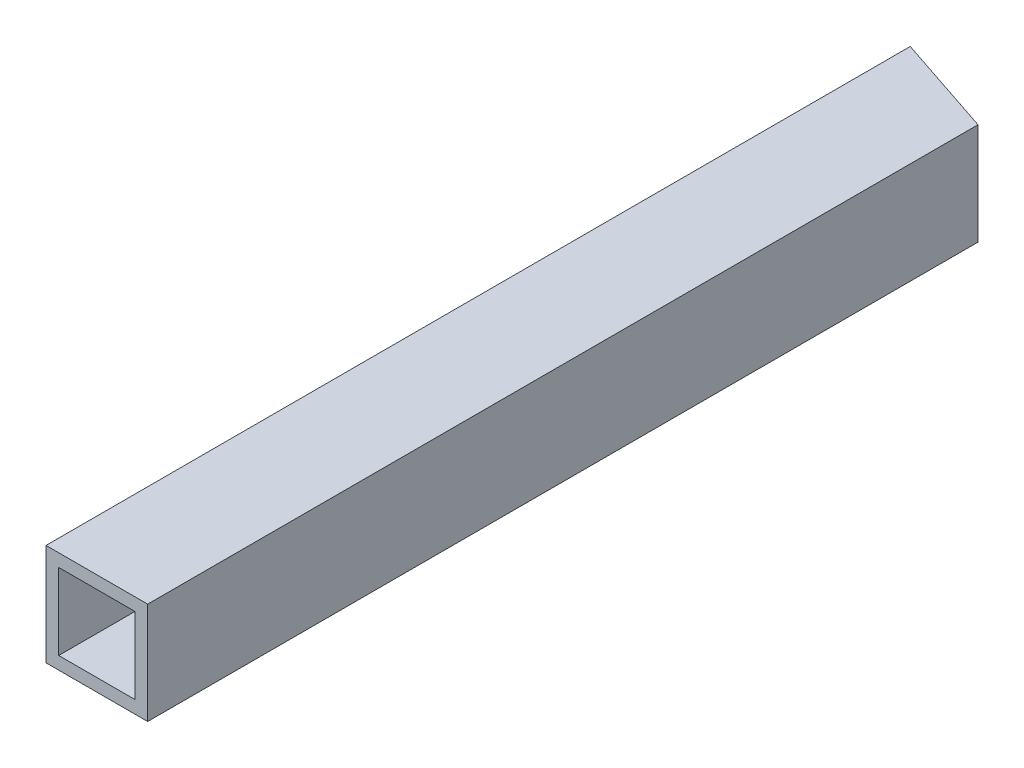
ISO-10303-21;
HEADER;
FILE_DESCRIPTION(('STEP AP214'),'2;1');
FILE_NAME('part.step','',(''),(''),'','','');
FILE_SCHEMA(('AUTOMOTIVE_DESIGN { 1 0 10303 214 1 1 1 1 }'));
ENDSEC;
DATA;
#1=APPLICATION_CONTEXT('core data for automotive mechanical design processes');
#2=APPLICATION_PROTOCOL_DEFINITION('international standard','automotive_design',2000,#1);
#3=PRODUCT_CONTEXT('',#1,'mechanical');
#4=PRODUCT('Part','Part','',(#3));
#5=PRODUCT_RELATED_PRODUCT_CATEGORY('part','',(#4));
#6=PRODUCT_DEFINITION_FORMATION('','',#4);
#7=PRODUCT_DEFINITION_CONTEXT('part definition',#1,'design');
#8=PRODUCT_DEFINITION('design','',#6,#7);
#9=PRODUCT_DEFINITION_SHAPE('','',#8);
#10=(LENGTH_UNIT() NAMED_UNIT(*) SI_UNIT(.MILLI.,.METRE.));
#11=(NAMED_UNIT(*) PLANE_ANGLE_UNIT() SI_UNIT($,.RADIAN.));
#12=(NAMED_UNIT(*) SI_UNIT($,.STERADIAN.) SOLID_ANGLE_UNIT());
#13=UNCERTAINTY_MEASURE_WITH_UNIT(LENGTH_MEASURE(1.E-05),#10,'distance_accuracy_value','');
#14=(GEOMETRIC_REPRESENTATION_CONTEXT(3) GLOBAL_UNCERTAINTY_ASSIGNED_CONTEXT((#13)) GLOBAL_UNIT_ASSIGNED_CONTEXT((#10,
#11,#12)) REPRESENTATION_CONTEXT('',''));
#15=CARTESIAN_POINT('',(0.,0.,0.));
#16=DIRECTION('',(0.,0.,1.));
#17=DIRECTION('',(1.,0.,0.));
#18=AXIS2_PLACEMENT_3D('',#15,#16,#17);
#19=CARTESIAN_POINT('',(0.,0.,215.9));
#20=DIRECTION('',(0.,0.,-1.));
#21=DIRECTION('',(-1.,0.,0.));
#22=AXIS2_PLACEMENT_3D('',#19,#20,#21);
#23=PLANE('',#22);
#24=DIRECTION('',(0.,-1.,0.));
#25=VECTOR('',#24,1.);
#26=CARTESIAN_POINT('',(0.,0.,215.9));
#27=LINE('',#26,#25);
#28=CARTESIAN_POINT('',(0.,25.4,215.9));
#29=VERTEX_POINT('',#28);
#30=CARTESIAN_POINT('',(0.,0.,215.9));
#31=VERTEX_POINT('',#30);
#32=EDGE_CURVE('E124',#29,#31,#27,.T.);
#33=ORIENTED_EDGE('',*,*,#32,.T.);
#34=DIRECTION('',(1.,0.,0.));
#35=VECTOR('',#34,1.);
#36=CARTESIAN_POINT('',(0.,0.,215.9));
#37=LINE('',#36,#35);
#38=CARTESIAN_POINT('',(25.4,0.,215.9));
#39=VERTEX_POINT('',#38);
#40=EDGE_CURVE('E116',#31,#39,#37,.T.);
#41=ORIENTED_EDGE('',*,*,#40,.T.);
#42=DIRECTION('',(0.,1.,0.));
#43=VECTOR('',#42,1.);
#44=CARTESIAN_POINT('',(25.4,0.,215.9));
#45=LINE('',#44,#43);
#46=CARTESIAN_POINT('',(25.4,25.4,215.9));
#47=VERTEX_POINT('',#46);
#48=EDGE_CURVE('E143',#39,#47,#45,.T.);
#49=ORIENTED_EDGE('',*,*,#48,.T.);
#50=DIRECTION('',(-1.,0.,0.));
#51=VECTOR('',#50,1.);
#52=CARTESIAN_POINT('',(0.,25.4,215.9));
#53=LINE('',#52,#51);
#54=EDGE_CURVE('E133',#47,#29,#53,.T.);
#55=ORIENTED_EDGE('',*,*,#54,.T.);
#56=EDGE_LOOP('',(#33,#41,#49,#55));
#57=FACE_BOUND('',#56,.T.);
#58=DIRECTION('',(0.,-1.,0.));
#59=VECTOR('',#58,1.);
#60=CARTESIAN_POINT('',(3.175,22.225,215.9));
#61=LINE('',#60,#59);
#62=CARTESIAN_POINT('',(3.175,22.225,215.9));
#63=VERTEX_POINT('',#62);
#64=CARTESIAN_POINT('',(3.175,3.175,215.9));
#65=VERTEX_POINT('',#64);
#66=EDGE_CURVE('E160',#63,#65,#61,.T.);
#67=ORIENTED_EDGE('',*,*,#66,.F.);
#68=DIRECTION('',(-1.,0.,0.));
#69=VECTOR('',#68,1.);
#70=CARTESIAN_POINT('',(3.175,22.225,215.9));
#71=LINE('',#70,#69);
#72=CARTESIAN_POINT('',(22.225,22.225,215.9));
#73=VERTEX_POINT('',#72);
#74=EDGE_CURVE('E154',#73,#63,#71,.T.);
#75=ORIENTED_EDGE('',*,*,#74,.F.);
#76=DIRECTION('',(0.,1.,0.));
#77=VECTOR('',#76,1.);
#78=CARTESIAN_POINT('',(22.225,22.225,215.9));
#79=LINE('',#78,#77);
#80=CARTESIAN_POINT('',(22.225,3.175,215.9));
#81=VERTEX_POINT('',#80);
#82=EDGE_CURVE('E156',#81,#73,#79,.T.);
#83=ORIENTED_EDGE('',*,*,#82,.F.);
#84=DIRECTION('',(1.,0.,0.));
#85=VECTOR('',#84,1.);
#86=CARTESIAN_POINT('',(3.175,3.175,215.9));
#87=LINE('',#86,#85);
#88=EDGE_CURVE('E158',#65,#81,#87,.T.);
#89=ORIENTED_EDGE('',*,*,#88,.F.);
#90=EDGE_LOOP('',(#67,#75,#83,#89));
#91=FACE_BOUND('',#90,.T.);
#92=ADVANCED_FACE('F38',(#57,#91),#23,.F.);
#93=CARTESIAN_POINT('',(0.,0.,215.9));
#94=DIRECTION('',(1.,0.,0.));
#95=DIRECTION('',(0.,0.,-1.));
#96=AXIS2_PLACEMENT_3D('',#93,#94,#95);
#97=PLANE('',#96);
#98=DIRECTION('',(0.,-1.,0.));
#99=VECTOR('',#98,1.);
#100=CARTESIAN_POINT('',(0.,0.,0.));
#101=LINE('',#100,#99);
#102=CARTESIAN_POINT('',(0.,25.4,0.));
#103=VERTEX_POINT('',#102);
#104=CARTESIAN_POINT('',(0.,0.,0.));
#105=VERTEX_POINT('',#104);
#106=EDGE_CURVE('E105',#103,#105,#101,.T.);
#107=ORIENTED_EDGE('',*,*,#106,.T.);
#108=DIRECTION('',(0.,0.,-1.));
#109=VECTOR('',#108,1.);
#110=CARTESIAN_POINT('',(0.,0.,215.9));
#111=LINE('',#110,#109);
#112=EDGE_CURVE('E46',#31,#105,#111,.T.);
#113=ORIENTED_EDGE('',*,*,#112,.F.);
#114=ORIENTED_EDGE('',*,*,#32,.F.);
#115=DIRECTION('',(0.,0.,-1.));
#116=VECTOR('',#115,1.);
#117=CARTESIAN_POINT('',(0.,25.4,215.9));
#118=LINE('',#117,#116);
#119=EDGE_CURVE('E123',#29,#103,#118,.T.);
#120=ORIENTED_EDGE('',*,*,#119,.T.);
#121=EDGE_LOOP('',(#107,#113,#114,#120));
#122=FACE_BOUND('',#121,.T.);
#123=ADVANCED_FACE('F40',(#122),#97,.F.);
#124=CARTESIAN_POINT('',(0.,0.,215.9));
#125=DIRECTION('',(0.,1.,0.));
#126=DIRECTION('',(0.,0.,1.));
#127=AXIS2_PLACEMENT_3D('',#124,#125,#126);
#128=PLANE('',#127);
#129=ORIENTED_EDGE('',*,*,#112,.T.);
#130=DIRECTION('',(0.948655415828059,0.,0.316311400395389));
#131=VECTOR('',#130,1.);
#132=CARTESIAN_POINT('',(0.,0.,0.));
#133=LINE('',#132,#131);
#134=CARTESIAN_POINT('',(25.4,0.,8.46915480161983));
#135=VERTEX_POINT('',#134);
#136=EDGE_CURVE('E101',#105,#135,#133,.T.);
#137=ORIENTED_EDGE('',*,*,#136,.T.);
#138=DIRECTION('',(0.,0.,-1.));
#139=VECTOR('',#138,1.);
#140=CARTESIAN_POINT('',(25.4,0.,215.9));
#141=LINE('',#140,#139);
#142=EDGE_CURVE('E120',#39,#135,#141,.T.);
#143=ORIENTED_EDGE('',*,*,#142,.F.);
#144=ORIENTED_EDGE('',*,*,#40,.F.);
#145=EDGE_LOOP('',(#129,#137,#143,#144));
#146=FACE_BOUND('',#145,.T.);
#147=ADVANCED_FACE('F115',(#146),#128,.F.);
#148=CARTESIAN_POINT('',(25.4,0.,215.9));
#149=DIRECTION('',(-1.,0.,0.));
#150=DIRECTION('',(0.,0.,1.));
#151=AXIS2_PLACEMENT_3D('',#148,#149,#150);
#152=PLANE('',#151);
#153=ORIENTED_EDGE('',*,*,#142,.T.);
#154=DIRECTION('',(0.,1.,0.));
#155=VECTOR('',#154,1.);
#156=CARTESIAN_POINT('',(25.4,0.,8.46915480161983));
#157=LINE('',#156,#155);
#158=CARTESIAN_POINT('',(25.4,25.4,8.46915480161983));
#159=VERTEX_POINT('',#158);
#160=EDGE_CURVE('E108',#135,#159,#157,.T.);
#161=ORIENTED_EDGE('',*,*,#160,.T.);
#162=DIRECTION('',(0.,0.,-1.));
#163=VECTOR('',#162,1.);
#164=CARTESIAN_POINT('',(25.4,25.4,215.9));
#165=LINE('',#164,#163);
#166=EDGE_CURVE('E136',#47,#159,#165,.T.);
#167=ORIENTED_EDGE('',*,*,#166,.F.);
#168=ORIENTED_EDGE('',*,*,#48,.F.);
#169=EDGE_LOOP('',(#153,#161,#167,#168));
#170=FACE_BOUND('',#169,.T.);
#171=ADVANCED_FACE('F141',(#170),#152,.F.);
#172=CARTESIAN_POINT('',(0.,25.4,215.9));
#173=DIRECTION('',(0.,-1.,0.));
#174=DIRECTION('',(0.,0.,-1.));
#175=AXIS2_PLACEMENT_3D('',#172,#173,#174);
#176=PLANE('',#175);
#177=ORIENTED_EDGE('',*,*,#166,.T.);
#178=DIRECTION('',(0.948655415828059,0.,0.316311400395389));
#179=VECTOR('',#178,1.);
#180=CARTESIAN_POINT('',(0.,25.4,0.));
#181=LINE('',#180,#179);
#182=EDGE_CURVE('E112',#103,#159,#181,.T.);
#183=ORIENTED_EDGE('',*,*,#182,.F.);
#184=ORIENTED_EDGE('',*,*,#119,.F.);
#185=ORIENTED_EDGE('',*,*,#54,.F.);
#186=EDGE_LOOP('',(#177,#183,#184,#185));
#187=FACE_BOUND('',#186,.T.);
#188=ADVANCED_FACE('F169',(#187),#176,.F.);
#189=CARTESIAN_POINT('',(3.175,22.225,215.9));
#190=DIRECTION('',(1.,0.,0.));
#191=DIRECTION('',(0.,1.,0.));
#192=AXIS2_PLACEMENT_3D('',#189,#190,#191);
#193=PLANE('',#192);
#194=DIRECTION('',(0.,-1.,0.));
#195=VECTOR('',#194,1.);
#196=CARTESIAN_POINT('',(3.175,22.225,1.05864435020248));
#197=LINE('',#196,#195);
#198=CARTESIAN_POINT('',(3.175,22.225,1.05864435020247));
#199=VERTEX_POINT('',#198);
#200=CARTESIAN_POINT('',(3.175,3.175,1.05864435020248));
#201=VERTEX_POINT('',#200);
#202=EDGE_CURVE('E162',#199,#201,#197,.T.);
#203=ORIENTED_EDGE('',*,*,#202,.F.);
#204=DIRECTION('',(0.,0.,-1.));
#205=VECTOR('',#204,1.);
#206=CARTESIAN_POINT('',(3.175,22.225,215.9));
#207=LINE('',#206,#205);
#208=EDGE_CURVE('E151',#63,#199,#207,.T.);
#209=ORIENTED_EDGE('',*,*,#208,.F.);
#210=ORIENTED_EDGE('',*,*,#66,.T.);
#211=DIRECTION('',(0.,0.,-1.));
#212=VECTOR('',#211,1.);
#213=CARTESIAN_POINT('',(3.175,3.175,215.9));
#214=LINE('',#213,#212);
#215=EDGE_CURVE('E125',#65,#201,#214,.T.);
#216=ORIENTED_EDGE('',*,*,#215,.T.);
#217=EDGE_LOOP('',(#203,#209,#210,#216));
#218=FACE_BOUND('',#217,.T.);
#219=ADVANCED_FACE('F181',(#218),#193,.T.);
#220=CARTESIAN_POINT('',(3.175,3.175,215.9));
#221=DIRECTION('',(0.,1.,0.));
#222=DIRECTION('',(0.,0.,1.));
#223=AXIS2_PLACEMENT_3D('',#220,#221,#222);
#224=PLANE('',#223);
#225=DIRECTION('',(0.948655415828059,0.,0.316311400395388));
#226=VECTOR('',#225,1.);
#227=CARTESIAN_POINT('',(67.6425579675994,3.175,22.5541454568954));
#228=LINE('',#227,#226);
#229=CARTESIAN_POINT('',(22.225,3.175,7.41051045141736));
#230=VERTEX_POINT('',#229);
#231=EDGE_CURVE('E164',#201,#230,#228,.T.);
#232=ORIENTED_EDGE('',*,*,#231,.F.);
#233=ORIENTED_EDGE('',*,*,#215,.F.);
#234=ORIENTED_EDGE('',*,*,#88,.T.);
#235=DIRECTION('',(0.,0.,-1.));
#236=VECTOR('',#235,1.);
#237=CARTESIAN_POINT('',(22.225,3.175,215.9));
#238=LINE('',#237,#236);
#239=EDGE_CURVE('E129',#81,#230,#238,.T.);
#240=ORIENTED_EDGE('',*,*,#239,.T.);
#241=EDGE_LOOP('',(#232,#233,#234,#240));
#242=FACE_BOUND('',#241,.T.);
#243=ADVANCED_FACE('F184',(#242),#224,.T.);
#244=CARTESIAN_POINT('',(22.225,22.225,215.9));
#245=DIRECTION('',(-1.,0.,0.));
#246=DIRECTION('',(0.,-1.,0.));
#247=AXIS2_PLACEMENT_3D('',#244,#245,#246);
#248=PLANE('',#247);
#249=DIRECTION('',(0.,1.,0.));
#250=VECTOR('',#249,1.);
#251=CARTESIAN_POINT('',(22.225,22.225,7.41051045141736));
#252=LINE('',#251,#250);
#253=CARTESIAN_POINT('',(22.225,22.225,7.41051045141735));
#254=VERTEX_POINT('',#253);
#255=EDGE_CURVE('E52',#230,#254,#252,.T.);
#256=ORIENTED_EDGE('',*,*,#255,.F.);
#257=ORIENTED_EDGE('',*,*,#239,.F.);
#258=ORIENTED_EDGE('',*,*,#82,.T.);
#259=DIRECTION('',(0.,0.,-1.));
#260=VECTOR('',#259,1.);
#261=CARTESIAN_POINT('',(22.225,22.225,215.9));
#262=LINE('',#261,#260);
#263=EDGE_CURVE('E59',#73,#254,#262,.T.);
#264=ORIENTED_EDGE('',*,*,#263,.T.);
#265=EDGE_LOOP('',(#256,#257,#258,#264));
#266=FACE_BOUND('',#265,.T.);
#267=ADVANCED_FACE('F187',(#266),#248,.T.);
#268=CARTESIAN_POINT('',(3.175,22.225,215.9));
#269=DIRECTION('',(0.,-1.,0.));
#270=DIRECTION('',(0.,0.,-1.));
#271=AXIS2_PLACEMENT_3D('',#268,#269,#270);
#272=PLANE('',#271);
#273=DIRECTION('',(-0.948655415828059,0.,-0.316311400395389));
#274=VECTOR('',#273,1.);
#275=CARTESIAN_POINT('',(67.6425579675994,22.225,22.5541454568954));
#276=LINE('',#275,#274);
#277=EDGE_CURVE('E11',#254,#199,#276,.T.);
#278=ORIENTED_EDGE('',*,*,#277,.F.);
#279=ORIENTED_EDGE('',*,*,#263,.F.);
#280=ORIENTED_EDGE('',*,*,#74,.T.);
#281=ORIENTED_EDGE('',*,*,#208,.T.);
#282=EDGE_LOOP('',(#278,#279,#280,#281));
#283=FACE_BOUND('',#282,.T.);
#284=ADVANCED_FACE('F189',(#283),#272,.T.);
#285=CARTESIAN_POINT('',(0.,0.,0.));
#286=DIRECTION('',(-0.316311400395388,0.,0.948655415828059));
#287=DIRECTION('',(0.948655415828059,0.,0.316311400395389));
#288=AXIS2_PLACEMENT_3D('',#285,#286,#287);
#289=PLANE('',#288);
#290=ORIENTED_EDGE('',*,*,#202,.T.);
#291=ORIENTED_EDGE('',*,*,#231,.T.);
#292=ORIENTED_EDGE('',*,*,#255,.T.);
#293=ORIENTED_EDGE('',*,*,#277,.T.);
#294=EDGE_LOOP('',(#290,#291,#292,#293));
#295=FACE_BOUND('',#294,.T.);
#296=ORIENTED_EDGE('',*,*,#182,.T.);
#297=ORIENTED_EDGE('',*,*,#160,.F.);
#298=ORIENTED_EDGE('',*,*,#136,.F.);
#299=ORIENTED_EDGE('',*,*,#106,.F.);
#300=EDGE_LOOP('',(#296,#297,#298,#299));
#301=FACE_BOUND('',#300,.T.);
#302=ADVANCED_FACE('F103',(#295,#301),#289,.F.);
#303=CLOSED_SHELL('',(#92,#123,#147,#171,#188,#219,#243,#267,#284,#302));
#304=MANIFOLD_SOLID_BREP('B2',#303);
#305=ADVANCED_BREP_SHAPE_REPRESENTATION('',(#18,#304),#14);
#306=SHAPE_DEFINITION_REPRESENTATION(#9,#305);
ENDSEC;
END-ISO-10303-21;
